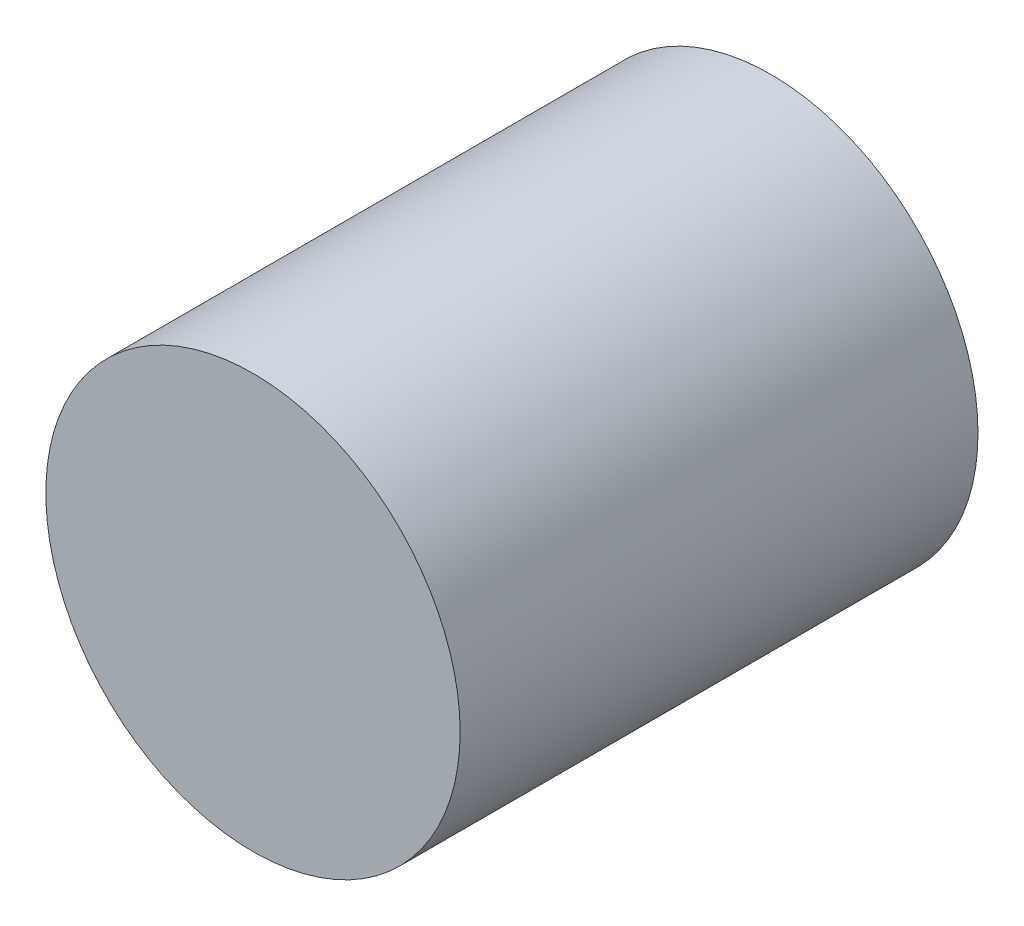
ISO-10303-21;
HEADER;
FILE_DESCRIPTION(('STEP AP214'),'2;1');
FILE_NAME('part.step','',(''),(''),'','','');
FILE_SCHEMA(('AUTOMOTIVE_DESIGN { 1 0 10303 214 1 1 1 1 }'));
ENDSEC;
DATA;
#1=APPLICATION_CONTEXT('core data for automotive mechanical design processes');
#2=APPLICATION_PROTOCOL_DEFINITION('international standard','automotive_design',2000,#1);
#3=PRODUCT_CONTEXT('',#1,'mechanical');
#4=PRODUCT('Part','Part','',(#3));
#5=PRODUCT_RELATED_PRODUCT_CATEGORY('part','',(#4));
#6=PRODUCT_DEFINITION_FORMATION('','',#4);
#7=PRODUCT_DEFINITION_CONTEXT('part definition',#1,'design');
#8=PRODUCT_DEFINITION('design','',#6,#7);
#9=PRODUCT_DEFINITION_SHAPE('','',#8);
#10=(LENGTH_UNIT() NAMED_UNIT(*) SI_UNIT(.MILLI.,.METRE.));
#11=(NAMED_UNIT(*) PLANE_ANGLE_UNIT() SI_UNIT($,.RADIAN.));
#12=(NAMED_UNIT(*) SI_UNIT($,.STERADIAN.) SOLID_ANGLE_UNIT());
#13=UNCERTAINTY_MEASURE_WITH_UNIT(LENGTH_MEASURE(1.E-05),#10,'distance_accuracy_value','');
#14=(GEOMETRIC_REPRESENTATION_CONTEXT(3) GLOBAL_UNCERTAINTY_ASSIGNED_CONTEXT((#13)) GLOBAL_UNIT_ASSIGNED_CONTEXT((#10,
#11,#12)) REPRESENTATION_CONTEXT('',''));
#15=CARTESIAN_POINT('',(0.,0.,0.));
#16=DIRECTION('',(0.,0.,1.));
#17=DIRECTION('',(1.,0.,0.));
#18=AXIS2_PLACEMENT_3D('',#15,#16,#17);
#19=CARTESIAN_POINT('',(0.,0.,15.));
#20=DIRECTION('',(0.,0.,-1.));
#21=DIRECTION('',(-1.,0.,0.));
#22=AXIS2_PLACEMENT_3D('',#19,#20,#21);
#23=CYLINDRICAL_SURFACE('',#22,6.);
#24=CARTESIAN_POINT('',(0.,0.,15.));
#25=DIRECTION('',(0.,0.,1.));
#26=DIRECTION('',(1.,0.,0.));
#27=AXIS2_PLACEMENT_3D('',#24,#25,#26);
#28=CIRCLE('',#27,6.);
#29=CARTESIAN_POINT('',(6.,0.,15.));
#30=VERTEX_POINT('',#29);
#31=EDGE_CURVE('E10',#30,#30,#28,.T.);
#32=ORIENTED_EDGE('',*,*,#31,.F.);
#33=EDGE_LOOP('',(#32));
#34=FACE_BOUND('',#33,.T.);
#35=CARTESIAN_POINT('',(0.,0.,0.));
#36=DIRECTION('',(0.,0.,1.));
#37=DIRECTION('',(1.,0.,0.));
#38=AXIS2_PLACEMENT_3D('',#35,#36,#37);
#39=CIRCLE('',#38,6.);
#40=CARTESIAN_POINT('',(6.,0.,0.));
#41=VERTEX_POINT('',#40);
#42=EDGE_CURVE('E40',#41,#41,#39,.T.);
#43=ORIENTED_EDGE('',*,*,#42,.T.);
#44=EDGE_LOOP('',(#43));
#45=FACE_BOUND('',#44,.T.);
#46=ADVANCED_FACE('F37',(#34,#45),#23,.T.);
#47=CARTESIAN_POINT('',(0.,0.,15.));
#48=DIRECTION('',(0.,0.,1.));
#49=DIRECTION('',(1.,0.,0.));
#50=AXIS2_PLACEMENT_3D('',#47,#48,#49);
#51=PLANE('',#50);
#52=ORIENTED_EDGE('',*,*,#31,.T.);
#53=EDGE_LOOP('',(#52));
#54=FACE_BOUND('',#53,.T.);
#55=ADVANCED_FACE('F54',(#54),#51,.T.);
#56=CARTESIAN_POINT('',(0.,0.,0.));
#57=DIRECTION('',(0.,0.,1.));
#58=DIRECTION('',(1.,0.,0.));
#59=AXIS2_PLACEMENT_3D('',#56,#57,#58);
#60=PLANE('',#59);
#61=ORIENTED_EDGE('',*,*,#42,.F.);
#62=EDGE_LOOP('',(#61));
#63=FACE_BOUND('',#62,.T.);
#64=ADVANCED_FACE('F52',(#63),#60,.F.);
#65=CLOSED_SHELL('',(#46,#55,#64));
#66=MANIFOLD_SOLID_BREP('B2',#65);
#67=ADVANCED_BREP_SHAPE_REPRESENTATION('',(#18,#66),#14);
#68=SHAPE_DEFINITION_REPRESENTATION(#9,#67);
ENDSEC;
END-ISO-10303-21;
